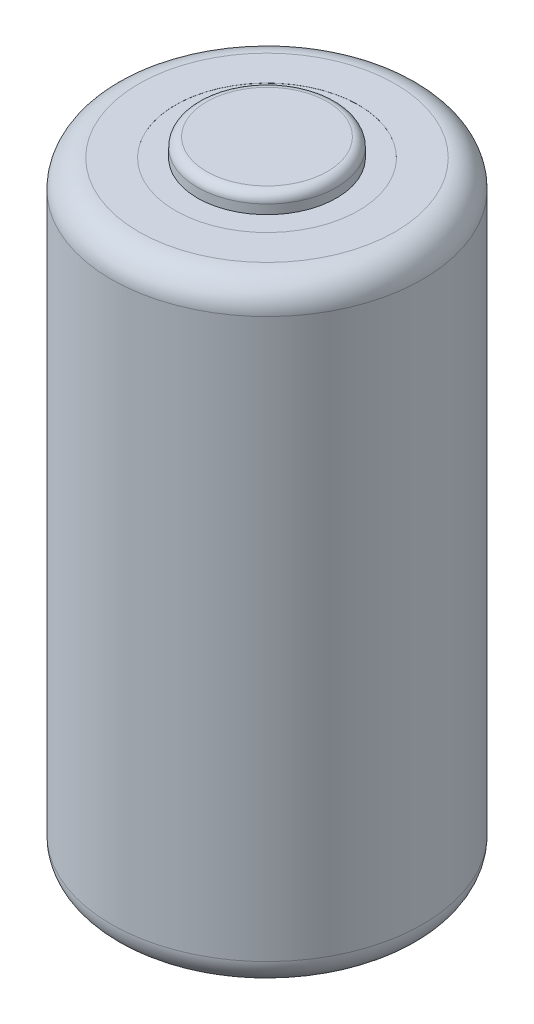
ISO-10303-21;
HEADER;
FILE_DESCRIPTION(('STEP AP214'),'2;1');
FILE_NAME('part.step','',(''),(''),'','','');
FILE_SCHEMA(('AUTOMOTIVE_DESIGN { 1 0 10303 214 1 1 1 1 }'));
ENDSEC;
DATA;
#1=APPLICATION_CONTEXT('core data for automotive mechanical design processes');
#2=APPLICATION_PROTOCOL_DEFINITION('international standard','automotive_design',2000,#1);
#3=PRODUCT_CONTEXT('',#1,'mechanical');
#4=PRODUCT('Part','Part','',(#3));
#5=PRODUCT_RELATED_PRODUCT_CATEGORY('part','',(#4));
#6=PRODUCT_DEFINITION_FORMATION('','',#4);
#7=PRODUCT_DEFINITION_CONTEXT('part definition',#1,'design');
#8=PRODUCT_DEFINITION('design','',#6,#7);
#9=PRODUCT_DEFINITION_SHAPE('','',#8);
#10=(LENGTH_UNIT() NAMED_UNIT(*) SI_UNIT(.MILLI.,.METRE.));
#11=(NAMED_UNIT(*) PLANE_ANGLE_UNIT() SI_UNIT($,.RADIAN.));
#12=(NAMED_UNIT(*) SI_UNIT($,.STERADIAN.) SOLID_ANGLE_UNIT());
#13=UNCERTAINTY_MEASURE_WITH_UNIT(LENGTH_MEASURE(1.E-05),#10,'distance_accuracy_value','');
#14=(GEOMETRIC_REPRESENTATION_CONTEXT(3) GLOBAL_UNCERTAINTY_ASSIGNED_CONTEXT((#13)) GLOBAL_UNIT_ASSIGNED_CONTEXT((#10,
#11,#12)) REPRESENTATION_CONTEXT('',''));
#15=CARTESIAN_POINT('',(0.,0.,0.));
#16=DIRECTION('',(0.,0.,1.));
#17=DIRECTION('',(1.,0.,0.));
#18=AXIS2_PLACEMENT_3D('',#15,#16,#17);
#19=CARTESIAN_POINT('',(0.,33.5,0.));
#20=DIRECTION('',(0.,1.,0.));
#21=DIRECTION('',(0.,0.,1.));
#22=AXIS2_PLACEMENT_3D('',#19,#20,#21);
#23=PLANE('',#22);
#24=CARTESIAN_POINT('',(0.,33.5,0.));
#25=DIRECTION('',(0.,1.,0.));
#26=DIRECTION('',(0.,0.,1.));
#27=AXIS2_PLACEMENT_3D('',#24,#25,#26);
#28=CIRCLE('',#27,5.);
#29=CARTESIAN_POINT('',(0.,33.5,5.));
#30=VERTEX_POINT('',#29);
#31=EDGE_CURVE('E59',#30,#30,#28,.T.);
#32=ORIENTED_EDGE('',*,*,#31,.F.);
#33=EDGE_LOOP('',(#32));
#34=FACE_BOUND('',#33,.T.);
#35=CARTESIAN_POINT('',(0.,33.5,0.));
#36=DIRECTION('',(0.,1.,0.));
#37=DIRECTION('',(0.,0.,1.));
#38=AXIS2_PLACEMENT_3D('',#35,#36,#37);
#39=CIRCLE('',#38,7.);
#40=CARTESIAN_POINT('',(0.,33.5,7.));
#41=VERTEX_POINT('',#40);
#42=EDGE_CURVE('E43',#41,#41,#39,.T.);
#43=ORIENTED_EDGE('',*,*,#42,.T.);
#44=EDGE_LOOP('',(#43));
#45=FACE_BOUND('',#44,.T.);
#46=ADVANCED_FACE('F32',(#34,#45),#23,.T.);
#47=CARTESIAN_POINT('',(0.,33.5,0.));
#48=DIRECTION('',(0.,-1.,0.));
#49=DIRECTION('',(0.,0.,-1.));
#50=AXIS2_PLACEMENT_3D('',#47,#48,#49);
#51=CYLINDRICAL_SURFACE('',#50,8.5);
#52=CARTESIAN_POINT('',(0.,1.5,0.));
#53=DIRECTION('',(0.,1.,0.));
#54=DIRECTION('',(0.,0.,1.));
#55=AXIS2_PLACEMENT_3D('',#52,#53,#54);
#56=CIRCLE('',#55,8.5);
#57=CARTESIAN_POINT('',(0.,1.5,8.5));
#58=VERTEX_POINT('',#57);
#59=EDGE_CURVE('E52',#58,#58,#56,.T.);
#60=ORIENTED_EDGE('',*,*,#59,.T.);
#61=EDGE_LOOP('',(#60));
#62=FACE_BOUND('',#61,.T.);
#63=CARTESIAN_POINT('',(0.,32.,0.));
#64=DIRECTION('',(0.,1.,0.));
#65=DIRECTION('',(0.,0.,1.));
#66=AXIS2_PLACEMENT_3D('',#63,#64,#65);
#67=CIRCLE('',#66,8.5);
#68=CARTESIAN_POINT('',(0.,32.,8.5));
#69=VERTEX_POINT('',#68);
#70=EDGE_CURVE('E55',#69,#69,#67,.F.);
#71=ORIENTED_EDGE('',*,*,#70,.T.);
#72=EDGE_LOOP('',(#71));
#73=FACE_BOUND('',#72,.T.);
#74=ADVANCED_FACE('F86',(#62,#73),#51,.T.);
#75=CARTESIAN_POINT('',(0.,0.,0.));
#76=DIRECTION('',(0.,1.,0.));
#77=DIRECTION('',(0.,0.,1.));
#78=AXIS2_PLACEMENT_3D('',#75,#76,#77);
#79=PLANE('',#78);
#80=CARTESIAN_POINT('',(0.,0.,0.));
#81=DIRECTION('',(0.,1.,0.));
#82=DIRECTION('',(0.,0.,1.));
#83=AXIS2_PLACEMENT_3D('',#80,#81,#82);
#84=CIRCLE('',#83,7.);
#85=CARTESIAN_POINT('',(0.,0.,7.));
#86=VERTEX_POINT('',#85);
#87=EDGE_CURVE('E47',#86,#86,#84,.F.);
#88=ORIENTED_EDGE('',*,*,#87,.T.);
#89=EDGE_LOOP('',(#88));
#90=FACE_BOUND('',#89,.T.);
#91=ADVANCED_FACE('F96',(#90),#79,.F.);
#92=CARTESIAN_POINT('',(0.,1.5,0.));
#93=DIRECTION('',(0.,1.,0.));
#94=DIRECTION('',(0.,0.,1.));
#95=AXIS2_PLACEMENT_3D('',#92,#93,#94);
#96=TOROIDAL_SURFACE('',#95,7.,1.5);
#97=ORIENTED_EDGE('',*,*,#87,.F.);
#98=EDGE_LOOP('',(#97));
#99=FACE_BOUND('',#98,.T.);
#100=ORIENTED_EDGE('',*,*,#59,.F.);
#101=EDGE_LOOP('',(#100));
#102=FACE_BOUND('',#101,.T.);
#103=ADVANCED_FACE('F91',(#99,#102),#96,.T.);
#104=CARTESIAN_POINT('',(0.,32.,0.));
#105=DIRECTION('',(0.,1.,0.));
#106=DIRECTION('',(0.,0.,1.));
#107=AXIS2_PLACEMENT_3D('',#104,#105,#106);
#108=TOROIDAL_SURFACE('',#107,7.,1.5);
#109=ORIENTED_EDGE('',*,*,#70,.F.);
#110=EDGE_LOOP('',(#109));
#111=FACE_BOUND('',#110,.T.);
#112=ORIENTED_EDGE('',*,*,#42,.F.);
#113=EDGE_LOOP('',(#112));
#114=FACE_BOUND('',#113,.T.);
#115=ADVANCED_FACE('F80',(#111,#114),#108,.T.);
#116=CARTESIAN_POINT('',(0.,33.495,0.));
#117=DIRECTION('',(0.,1.,0.));
#118=DIRECTION('',(0.,0.,1.));
#119=AXIS2_PLACEMENT_3D('',#116,#117,#118);
#120=CYLINDRICAL_SURFACE('',#119,5.);
#121=CARTESIAN_POINT('',(0.,33.495,0.));
#122=DIRECTION('',(0.,1.,0.));
#123=DIRECTION('',(0.,0.,1.));
#124=AXIS2_PLACEMENT_3D('',#121,#122,#123);
#125=CIRCLE('',#124,5.);
#126=CARTESIAN_POINT('',(0.,33.495,5.));
#127=VERTEX_POINT('',#126);
#128=EDGE_CURVE('E58',#127,#127,#125,.T.);
#129=CARTESIAN_POINT('',(0.,33.495,5.));
#130=CARTESIAN_POINT('',(0.,33.4950520833333,5.));
#131=CARTESIAN_POINT('',(0.,33.4951041666667,5.));
#132=CARTESIAN_POINT('',(0.,33.4952083333333,5.));
#133=CARTESIAN_POINT('',(0.,33.4952604166667,5.));
#134=CARTESIAN_POINT('',(0.,33.4953645833333,5.));
#135=CARTESIAN_POINT('',(0.,33.4954166666667,5.));
#136=CARTESIAN_POINT('',(0.,33.4955208333333,5.));
#137=CARTESIAN_POINT('',(0.,33.4955729166667,5.));
#138=CARTESIAN_POINT('',(0.,33.4956770833333,5.));
#139=CARTESIAN_POINT('',(0.,33.4957291666667,5.));
#140=CARTESIAN_POINT('',(0.,33.4958333333333,5.));
#141=CARTESIAN_POINT('',(0.,33.4958854166667,5.));
#142=CARTESIAN_POINT('',(0.,33.4959895833333,5.));
#143=CARTESIAN_POINT('',(0.,33.4960416666667,5.));
#144=CARTESIAN_POINT('',(0.,33.4961458333333,5.));
#145=CARTESIAN_POINT('',(0.,33.4961979166667,5.));
#146=CARTESIAN_POINT('',(0.,33.4963020833333,5.));
#147=CARTESIAN_POINT('',(0.,33.4963541666667,5.));
#148=CARTESIAN_POINT('',(0.,33.4964583333333,5.));
#149=CARTESIAN_POINT('',(0.,33.4965104166667,5.));
#150=CARTESIAN_POINT('',(0.,33.4966145833333,5.));
#151=CARTESIAN_POINT('',(0.,33.4966666666667,5.));
#152=CARTESIAN_POINT('',(0.,33.4967708333333,5.));
#153=CARTESIAN_POINT('',(0.,33.4968229166667,5.));
#154=CARTESIAN_POINT('',(0.,33.4969270833333,5.));
#155=CARTESIAN_POINT('',(0.,33.4969791666667,5.));
#156=CARTESIAN_POINT('',(0.,33.4970833333333,5.));
#157=CARTESIAN_POINT('',(0.,33.4971354166667,5.));
#158=CARTESIAN_POINT('',(0.,33.4972395833333,5.));
#159=CARTESIAN_POINT('',(0.,33.4972916666667,5.));
#160=CARTESIAN_POINT('',(0.,33.4973958333333,5.));
#161=CARTESIAN_POINT('',(0.,33.4974479166667,5.));
#162=CARTESIAN_POINT('',(0.,33.4975520833333,5.));
#163=CARTESIAN_POINT('',(0.,33.4976041666667,5.));
#164=CARTESIAN_POINT('',(0.,33.4977083333333,5.));
#165=CARTESIAN_POINT('',(0.,33.4977604166667,5.));
#166=CARTESIAN_POINT('',(0.,33.4978645833333,5.));
#167=CARTESIAN_POINT('',(0.,33.4979166666667,5.));
#168=CARTESIAN_POINT('',(0.,33.4980208333333,5.));
#169=CARTESIAN_POINT('',(0.,33.4980729166667,5.));
#170=CARTESIAN_POINT('',(0.,33.4981770833333,5.));
#171=CARTESIAN_POINT('',(0.,33.4982291666667,5.));
#172=CARTESIAN_POINT('',(0.,33.4983333333333,5.));
#173=CARTESIAN_POINT('',(0.,33.4983854166667,5.));
#174=CARTESIAN_POINT('',(0.,33.4984895833333,5.));
#175=CARTESIAN_POINT('',(0.,33.4985416666667,5.));
#176=CARTESIAN_POINT('',(0.,33.4986458333333,5.));
#177=CARTESIAN_POINT('',(0.,33.4986979166667,5.));
#178=CARTESIAN_POINT('',(0.,33.4988020833333,5.));
#179=CARTESIAN_POINT('',(0.,33.4988541666667,5.));
#180=CARTESIAN_POINT('',(0.,33.4989583333333,5.));
#181=CARTESIAN_POINT('',(0.,33.4990104166667,5.));
#182=CARTESIAN_POINT('',(0.,33.4991145833333,5.));
#183=CARTESIAN_POINT('',(0.,33.4991666666667,5.));
#184=CARTESIAN_POINT('',(0.,33.4992708333333,5.));
#185=CARTESIAN_POINT('',(0.,33.4993229166667,5.));
#186=CARTESIAN_POINT('',(0.,33.4994270833333,5.));
#187=CARTESIAN_POINT('',(0.,33.4994791666667,5.));
#188=CARTESIAN_POINT('',(0.,33.4995833333333,5.));
#189=CARTESIAN_POINT('',(0.,33.4996354166667,5.));
#190=CARTESIAN_POINT('',(0.,33.4997395833333,5.));
#191=CARTESIAN_POINT('',(0.,33.4997916666667,5.));
#192=CARTESIAN_POINT('',(0.,33.4998958333333,5.));
#193=CARTESIAN_POINT('',(0.,33.4999479166667,5.));
#194=CARTESIAN_POINT('',(0.,33.5,5.));
#195=B_SPLINE_CURVE_WITH_KNOTS('',3,(#129,#130,#131,#132,#133,#134,#135,#136,#137,#138,#139,
#140,#141,#142,#143,#144,#145,#146,#147,#148,#149,#150,#151,#152,#153,#154,#155,#156,#157,#158,
#159,#160,#161,#162,#163,#164,#165,#166,#167,#168,#169,#170,#171,#172,#173,#174,#175,#176,#177,
#178,#179,#180,#181,#182,#183,#184,#185,#186,#187,#188,#189,#190,#191,#192,#193,#194),
.UNSPECIFIED.,.F.,.F.,(4,2,2,2,2,2,2,2,2,2,2,2,2,2,2,2,2,2,2,2,2,2,2,2,2,2,2,2,2,2,2,2,4),(0.,
0.000156250000001024,0.000312500000002047,0.000468750000003071,0.000625000000004095,
0.000781250000005118,0.000937500000006142,0.00109375000000023,0.00125000000000125,
0.00140625000000227,0.0015625000000033,0.00171875000000432,0.00187500000000534,
0.00203124999999943,0.00218750000000045,0.00234375000000148,0.0025000000000025,
0.00265625000000352,0.00281250000000455,0.00296875000000557,0.00312499999999966,
0.00328125000000068,0.0034375000000017,0.00359375000000273,0.00375000000000375,
0.00390625000000477,0.00406249999999886,0.00421874999999988,0.00437500000000091,
0.00453125000000193,0.00468750000000295,0.00484375000000398,0.00499999999999806),.UNSPECIFIED.);
#196=EDGE_CURVE('BSEAM74',#127,#30,#195,.T.);
#197=ORIENTED_EDGE('',*,*,#128,.F.);
#198=ORIENTED_EDGE('',*,*,#31,.T.);
#199=ORIENTED_EDGE('',*,*,#196,.T.);
#200=ORIENTED_EDGE('',*,*,#196,.F.);
#201=EDGE_LOOP('',(#197,#199,#198,#200));
#202=FACE_BOUND('',#201,.T.);
#203=ADVANCED_FACE('F74',(#202),#120,.F.);
#204=CARTESIAN_POINT('',(0.,33.495,0.));
#205=DIRECTION('',(0.,1.,0.));
#206=DIRECTION('',(0.,0.,1.));
#207=AXIS2_PLACEMENT_3D('',#204,#205,#206);
#208=PLANE('',#207);
#209=CARTESIAN_POINT('',(0.,33.495,0.));
#210=DIRECTION('',(0.,1.,0.));
#211=DIRECTION('',(0.,0.,1.));
#212=AXIS2_PLACEMENT_3D('',#209,#210,#211);
#213=CIRCLE('',#212,3.7999885534321);
#214=CARTESIAN_POINT('',(0.,33.495,3.7999885534321));
#215=VERTEX_POINT('',#214);
#216=EDGE_CURVE('E62',#215,#215,#213,.T.);
#217=ORIENTED_EDGE('',*,*,#216,.F.);
#218=EDGE_LOOP('',(#217));
#219=FACE_BOUND('',#218,.T.);
#220=ORIENTED_EDGE('',*,*,#128,.T.);
#221=EDGE_LOOP('',(#220));
#222=FACE_BOUND('',#221,.T.);
#223=ADVANCED_FACE('F70',(#219,#222),#208,.T.);
#224=CARTESIAN_POINT('',(0.,34.5,0.));
#225=DIRECTION('',(0.,1.,0.));
#226=DIRECTION('',(0.,0.,1.));
#227=AXIS2_PLACEMENT_3D('',#224,#225,#226);
#228=PLANE('',#227);
#229=CARTESIAN_POINT('',(0.,34.5,0.));
#230=DIRECTION('',(0.,1.,0.));
#231=DIRECTION('',(0.,0.,1.));
#232=AXIS2_PLACEMENT_3D('',#229,#230,#231);
#233=CIRCLE('',#232,3.2999885534321);
#234=CARTESIAN_POINT('',(0.,34.5,3.2999885534321));
#235=VERTEX_POINT('',#234);
#236=EDGE_CURVE('E39',#235,#235,#233,.T.);
#237=ORIENTED_EDGE('',*,*,#236,.T.);
#238=EDGE_LOOP('',(#237));
#239=FACE_BOUND('',#238,.T.);
#240=ADVANCED_FACE('F73',(#239),#228,.T.);
#241=CARTESIAN_POINT('',(0.,34.,0.));
#242=DIRECTION('',(0.,1.,0.));
#243=DIRECTION('',(0.,0.,1.));
#244=AXIS2_PLACEMENT_3D('',#241,#242,#243);
#245=TOROIDAL_SURFACE('',#244,3.2999885534321,0.5);
#246=CARTESIAN_POINT('',(0.,34.,0.));
#247=DIRECTION('',(0.,1.,0.));
#248=DIRECTION('',(0.,0.,1.));
#249=AXIS2_PLACEMENT_3D('',#246,#247,#248);
#250=CIRCLE('',#249,3.7999885534321);
#251=CARTESIAN_POINT('',(0.,34.,3.7999885534321));
#252=VERTEX_POINT('',#251);
#253=EDGE_CURVE('E10',#252,#252,#250,.F.);
#254=ORIENTED_EDGE('',*,*,#253,.F.);
#255=EDGE_LOOP('',(#254));
#256=FACE_BOUND('',#255,.T.);
#257=ORIENTED_EDGE('',*,*,#236,.F.);
#258=EDGE_LOOP('',(#257));
#259=FACE_BOUND('',#258,.T.);
#260=ADVANCED_FACE('F34',(#256,#259),#245,.T.);
#261=CARTESIAN_POINT('',(0.,34.5,0.));
#262=DIRECTION('',(0.,-1.,0.));
#263=DIRECTION('',(0.,0.,-1.));
#264=AXIS2_PLACEMENT_3D('',#261,#262,#263);
#265=CYLINDRICAL_SURFACE('',#264,3.7999885534321);
#266=ORIENTED_EDGE('',*,*,#253,.T.);
#267=EDGE_LOOP('',(#266));
#268=FACE_BOUND('',#267,.T.);
#269=ORIENTED_EDGE('',*,*,#216,.T.);
#270=EDGE_LOOP('',(#269));
#271=FACE_BOUND('',#270,.T.);
#272=ADVANCED_FACE('F68',(#268,#271),#265,.T.);
#273=CLOSED_SHELL('',(#46,#74,#91,#103,#115,#203,#223,#240,#260,#272));
#274=MANIFOLD_SOLID_BREP('B2',#273);
#275=ADVANCED_BREP_SHAPE_REPRESENTATION('',(#18,#274),#14);
#276=SHAPE_DEFINITION_REPRESENTATION(#9,#275);
ENDSEC;
END-ISO-10303-21;
